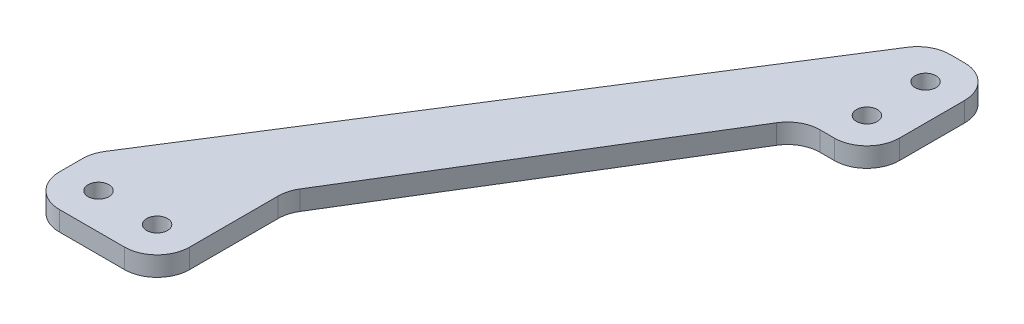
ISO-10303-21;
HEADER;
FILE_DESCRIPTION(('STEP AP214'),'2;1');
FILE_NAME('part.step','',(''),(''),'','','');
FILE_SCHEMA(('AUTOMOTIVE_DESIGN { 1 0 10303 214 1 1 1 1 }'));
ENDSEC;
DATA;
#1=APPLICATION_CONTEXT('core data for automotive mechanical design processes');
#2=APPLICATION_PROTOCOL_DEFINITION('international standard','automotive_design',2000,#1);
#3=PRODUCT_CONTEXT('',#1,'mechanical');
#4=PRODUCT('Part','Part','',(#3));
#5=PRODUCT_RELATED_PRODUCT_CATEGORY('part','',(#4));
#6=PRODUCT_DEFINITION_FORMATION('','',#4);
#7=PRODUCT_DEFINITION_CONTEXT('part definition',#1,'design');
#8=PRODUCT_DEFINITION('design','',#6,#7);
#9=PRODUCT_DEFINITION_SHAPE('','',#8);
#10=(LENGTH_UNIT() NAMED_UNIT(*) SI_UNIT(.MILLI.,.METRE.));
#11=(NAMED_UNIT(*) PLANE_ANGLE_UNIT() SI_UNIT($,.RADIAN.));
#12=(NAMED_UNIT(*) SI_UNIT($,.STERADIAN.) SOLID_ANGLE_UNIT());
#13=UNCERTAINTY_MEASURE_WITH_UNIT(LENGTH_MEASURE(1.E-05),#10,'distance_accuracy_value','');
#14=(GEOMETRIC_REPRESENTATION_CONTEXT(3) GLOBAL_UNCERTAINTY_ASSIGNED_CONTEXT((#13)) GLOBAL_UNIT_ASSIGNED_CONTEXT((#10,
#11,#12)) REPRESENTATION_CONTEXT('',''));
#15=CARTESIAN_POINT('',(0.,0.,0.));
#16=DIRECTION('',(0.,0.,1.));
#17=DIRECTION('',(1.,0.,0.));
#18=AXIS2_PLACEMENT_3D('',#15,#16,#17);
#19=CARTESIAN_POINT('',(0.,3.,0.));
#20=DIRECTION('',(0.,-1.,0.));
#21=DIRECTION('',(0.,0.,-1.));
#22=AXIS2_PLACEMENT_3D('',#19,#20,#21);
#23=PLANE('',#22);
#24=DIRECTION('',(-0.534797593347791,0.,0.84498019748951));
#25=VECTOR('',#24,1.);
#26=CARTESIAN_POINT('',(50.,3.,-89.));
#27=LINE('',#26,#25);
#28=CARTESIAN_POINT('',(48.5278404852778,3.,-86.6739879667389));
#29=VERTEX_POINT('',#28);
#30=CARTESIAN_POINT('',(0.775099012552454,3.,-11.2246564398329));
#31=VERTEX_POINT('',#30);
#32=EDGE_CURVE('E323',#29,#31,#27,.T.);
#33=ORIENTED_EDGE('',*,*,#32,.T.);
#34=CARTESIAN_POINT('',(5.,3.,-8.55066847309392));
#35=DIRECTION('',(0.,-1.,0.));
#36=DIRECTION('',(0.,0.,-1.));
#37=AXIS2_PLACEMENT_3D('',#34,#35,#36);
#38=CIRCLE('',#37,5.);
#39=CARTESIAN_POINT('',(0.,3.,-8.55066847309392));
#40=VERTEX_POINT('',#39);
#41=EDGE_CURVE('E230',#31,#40,#38,.F.);
#42=ORIENTED_EDGE('',*,*,#41,.T.);
#43=DIRECTION('',(0.,0.,1.));
#44=VECTOR('',#43,1.);
#45=CARTESIAN_POINT('',(0.,3.,-10.));
#46=LINE('',#45,#44);
#47=CARTESIAN_POINT('',(0.,3.,-5.));
#48=VERTEX_POINT('',#47);
#49=EDGE_CURVE('E175',#40,#48,#46,.T.);
#50=ORIENTED_EDGE('',*,*,#49,.T.);
#51=CARTESIAN_POINT('',(5.,3.,-5.));
#52=DIRECTION('',(0.,-1.,0.));
#53=DIRECTION('',(0.,0.,-1.));
#54=AXIS2_PLACEMENT_3D('',#51,#52,#53);
#55=CIRCLE('',#54,5.);
#56=CARTESIAN_POINT('',(5.,3.,0.));
#57=VERTEX_POINT('',#56);
#58=EDGE_CURVE('E219',#48,#57,#55,.F.);
#59=ORIENTED_EDGE('',*,*,#58,.T.);
#60=DIRECTION('',(1.,0.,0.));
#61=VECTOR('',#60,1.);
#62=CARTESIAN_POINT('',(0.,3.,0.));
#63=LINE('',#62,#61);
#64=CARTESIAN_POINT('',(15.,3.,0.));
#65=VERTEX_POINT('',#64);
#66=EDGE_CURVE('E185',#57,#65,#63,.T.);
#67=ORIENTED_EDGE('',*,*,#66,.T.);
#68=CARTESIAN_POINT('',(15.,3.,-5.));
#69=DIRECTION('',(0.,-1.,0.));
#70=DIRECTION('',(0.,0.,-1.));
#71=AXIS2_PLACEMENT_3D('',#68,#69,#70);
#72=CIRCLE('',#71,5.);
#73=CARTESIAN_POINT('',(20.,3.,-5.));
#74=VERTEX_POINT('',#73);
#75=EDGE_CURVE('E216',#65,#74,#72,.F.);
#76=ORIENTED_EDGE('',*,*,#75,.T.);
#77=DIRECTION('',(0.,0.,-1.));
#78=VECTOR('',#77,1.);
#79=CARTESIAN_POINT('',(20.,3.,-20.));
#80=LINE('',#79,#78);
#81=CARTESIAN_POINT('',(20.,3.,-18.5909450518512));
#82=VERTEX_POINT('',#81);
#83=EDGE_CURVE('E191',#74,#82,#80,.T.);
#84=ORIENTED_EDGE('',*,*,#83,.T.);
#85=CARTESIAN_POINT('',(25.,3.,-18.5909450518512));
#86=DIRECTION('',(0.,-1.,0.));
#87=DIRECTION('',(0.,0.,-1.));
#88=AXIS2_PLACEMENT_3D('',#85,#86,#87);
#89=CIRCLE('',#88,5.);
#90=CARTESIAN_POINT('',(20.7357434796187,3.,-21.2017143500438));
#91=VERTEX_POINT('',#90);
#92=EDGE_CURVE('E11',#82,#91,#89,.T.);
#93=ORIENTED_EDGE('',*,*,#92,.T.);
#94=DIRECTION('',(0.52215385963853,0.,-0.852851304076266));
#95=VECTOR('',#94,1.);
#96=CARTESIAN_POINT('',(50.,3.,-69.));
#97=LINE('',#96,#95);
#98=CARTESIAN_POINT('',(48.537205692771,3.,-66.6107692981927));
#99=VERTEX_POINT('',#98);
#100=EDGE_CURVE('E303',#91,#99,#97,.T.);
#101=ORIENTED_EDGE('',*,*,#100,.T.);
#102=CARTESIAN_POINT('',(52.8014622131523,3.,-64.));
#103=DIRECTION('',(0.,-1.,0.));
#104=DIRECTION('',(0.,0.,-1.));
#105=AXIS2_PLACEMENT_3D('',#102,#103,#104);
#106=CIRCLE('',#105,5.);
#107=CARTESIAN_POINT('',(52.8014622131523,3.,-69.));
#108=VERTEX_POINT('',#107);
#109=EDGE_CURVE('E277',#99,#108,#106,.T.);
#110=ORIENTED_EDGE('',*,*,#109,.T.);
#111=DIRECTION('',(1.,0.,0.));
#112=VECTOR('',#111,1.);
#113=CARTESIAN_POINT('',(60.,3.,-69.));
#114=LINE('',#113,#112);
#115=CARTESIAN_POINT('',(55.,3.,-69.));
#116=VERTEX_POINT('',#115);
#117=EDGE_CURVE('E309',#108,#116,#114,.T.);
#118=ORIENTED_EDGE('',*,*,#117,.T.);
#119=CARTESIAN_POINT('',(55.,3.,-74.));
#120=DIRECTION('',(0.,-1.,0.));
#121=DIRECTION('',(0.,0.,-1.));
#122=AXIS2_PLACEMENT_3D('',#119,#120,#121);
#123=CIRCLE('',#122,5.);
#124=CARTESIAN_POINT('',(60.,3.,-74.));
#125=VERTEX_POINT('',#124);
#126=EDGE_CURVE('E222',#116,#125,#123,.F.);
#127=ORIENTED_EDGE('',*,*,#126,.T.);
#128=DIRECTION('',(0.,0.,-1.));
#129=VECTOR('',#128,1.);
#130=CARTESIAN_POINT('',(60.,3.,-69.));
#131=LINE('',#130,#129);
#132=CARTESIAN_POINT('',(60.,3.,-84.));
#133=VERTEX_POINT('',#132);
#134=EDGE_CURVE('E314',#125,#133,#131,.T.);
#135=ORIENTED_EDGE('',*,*,#134,.T.);
#136=CARTESIAN_POINT('',(55.,3.,-84.));
#137=DIRECTION('',(0.,-1.,0.));
#138=DIRECTION('',(0.,0.,-1.));
#139=AXIS2_PLACEMENT_3D('',#136,#137,#138);
#140=CIRCLE('',#139,5.);
#141=CARTESIAN_POINT('',(55.,3.,-89.));
#142=VERTEX_POINT('',#141);
#143=EDGE_CURVE('E62',#133,#142,#140,.F.);
#144=ORIENTED_EDGE('',*,*,#143,.T.);
#145=DIRECTION('',(-1.,0.,0.));
#146=VECTOR('',#145,1.);
#147=CARTESIAN_POINT('',(60.,3.,-89.));
#148=LINE('',#147,#146);
#149=CARTESIAN_POINT('',(52.7527414727254,3.,-89.));
#150=VERTEX_POINT('',#149);
#151=EDGE_CURVE('E320',#142,#150,#148,.T.);
#152=ORIENTED_EDGE('',*,*,#151,.T.);
#153=CARTESIAN_POINT('',(52.7527414727254,3.,-84.));
#154=DIRECTION('',(0.,-1.,0.));
#155=DIRECTION('',(0.,0.,-1.));
#156=AXIS2_PLACEMENT_3D('',#153,#154,#155);
#157=CIRCLE('',#156,5.);
#158=EDGE_CURVE('E227',#150,#29,#157,.F.);
#159=ORIENTED_EDGE('',*,*,#158,.T.);
#160=EDGE_LOOP('',(#33,#42,#50,#59,#67,#76,#84,#93,#101,#110,#118,#127,#135,#144,#152,#159));
#161=FACE_BOUND('',#160,.T.);
#162=CARTESIAN_POINT('',(54.5,3.,-83.5));
#163=DIRECTION('',(0.,1.,0.));
#164=DIRECTION('',(0.,0.,1.));
#165=AXIS2_PLACEMENT_3D('',#162,#163,#164);
#166=CIRCLE('',#165,1.6);
#167=CARTESIAN_POINT('',(54.5,3.,-81.9));
#168=VERTEX_POINT('',#167);
#169=EDGE_CURVE('E330',#168,#168,#166,.T.);
#170=ORIENTED_EDGE('',*,*,#169,.F.);
#171=EDGE_LOOP('',(#170));
#172=FACE_BOUND('',#171,.T.);
#173=CARTESIAN_POINT('',(54.5,3.,-74.5));
#174=DIRECTION('',(0.,1.,0.));
#175=DIRECTION('',(0.,0.,-1.));
#176=AXIS2_PLACEMENT_3D('',#173,#174,#175);
#177=CIRCLE('',#176,1.6);
#178=CARTESIAN_POINT('',(54.5,3.,-76.1));
#179=VERTEX_POINT('',#178);
#180=EDGE_CURVE('E411',#179,#179,#177,.T.);
#181=ORIENTED_EDGE('',*,*,#180,.F.);
#182=EDGE_LOOP('',(#181));
#183=FACE_BOUND('',#182,.T.);
#184=CARTESIAN_POINT('',(5.5,3.,-5.5));
#185=DIRECTION('',(0.,1.,0.));
#186=DIRECTION('',(0.,0.,1.));
#187=AXIS2_PLACEMENT_3D('',#184,#185,#186);
#188=CIRCLE('',#187,1.6);
#189=CARTESIAN_POINT('',(5.5,3.,-3.9));
#190=VERTEX_POINT('',#189);
#191=EDGE_CURVE('E403',#190,#190,#188,.T.);
#192=ORIENTED_EDGE('',*,*,#191,.F.);
#193=EDGE_LOOP('',(#192));
#194=FACE_BOUND('',#193,.T.);
#195=CARTESIAN_POINT('',(14.5,3.,-5.5));
#196=DIRECTION('',(0.,1.,0.));
#197=DIRECTION('',(0.,0.,1.));
#198=AXIS2_PLACEMENT_3D('',#195,#196,#197);
#199=CIRCLE('',#198,1.6);
#200=CARTESIAN_POINT('',(14.5,3.,-3.9));
#201=VERTEX_POINT('',#200);
#202=EDGE_CURVE('E392',#201,#201,#199,.T.);
#203=ORIENTED_EDGE('',*,*,#202,.F.);
#204=EDGE_LOOP('',(#203));
#205=FACE_BOUND('',#204,.T.);
#206=ADVANCED_FACE('F39',(#161,#172,#183,#194,#205),#23,.F.);
#207=CARTESIAN_POINT('',(0.,0.,0.));
#208=DIRECTION('',(0.,-1.,0.));
#209=DIRECTION('',(0.,0.,-1.));
#210=AXIS2_PLACEMENT_3D('',#207,#208,#209);
#211=PLANE('',#210);
#212=CARTESIAN_POINT('',(5.5,0.,-5.5));
#213=DIRECTION('',(0.,1.,0.));
#214=DIRECTION('',(0.,0.,1.));
#215=AXIS2_PLACEMENT_3D('',#212,#213,#214);
#216=CIRCLE('',#215,1.6);
#217=CARTESIAN_POINT('',(5.5,0.,-3.9));
#218=VERTEX_POINT('',#217);
#219=EDGE_CURVE('E400',#218,#218,#216,.T.);
#220=ORIENTED_EDGE('',*,*,#219,.T.);
#221=EDGE_LOOP('',(#220));
#222=FACE_BOUND('',#221,.T.);
#223=CARTESIAN_POINT('',(54.5,0.,-83.5));
#224=DIRECTION('',(0.,1.,0.));
#225=DIRECTION('',(0.,0.,1.));
#226=AXIS2_PLACEMENT_3D('',#223,#224,#225);
#227=CIRCLE('',#226,1.6);
#228=CARTESIAN_POINT('',(54.5,0.,-81.9));
#229=VERTEX_POINT('',#228);
#230=EDGE_CURVE('E415',#229,#229,#227,.T.);
#231=ORIENTED_EDGE('',*,*,#230,.T.);
#232=EDGE_LOOP('',(#231));
#233=FACE_BOUND('',#232,.T.);
#234=DIRECTION('',(0.,0.,1.));
#235=VECTOR('',#234,1.);
#236=CARTESIAN_POINT('',(0.,0.,-10.));
#237=LINE('',#236,#235);
#238=CARTESIAN_POINT('',(0.,0.,-8.55066847309392));
#239=VERTEX_POINT('',#238);
#240=CARTESIAN_POINT('',(0.,0.,-5.));
#241=VERTEX_POINT('',#240);
#242=EDGE_CURVE('E172',#239,#241,#237,.T.);
#243=ORIENTED_EDGE('',*,*,#242,.F.);
#244=CARTESIAN_POINT('',(5.,0.,-8.55066847309392));
#245=DIRECTION('',(0.,-1.,0.));
#246=DIRECTION('',(0.,0.,-1.));
#247=AXIS2_PLACEMENT_3D('',#244,#245,#246);
#248=CIRCLE('',#247,5.);
#249=CARTESIAN_POINT('',(0.775099012552454,0.,-11.2246564398329));
#250=VERTEX_POINT('',#249);
#251=EDGE_CURVE('E154',#239,#250,#248,.T.);
#252=ORIENTED_EDGE('',*,*,#251,.T.);
#253=DIRECTION('',(-0.534797593347791,0.,0.84498019748951));
#254=VECTOR('',#253,1.);
#255=CARTESIAN_POINT('',(50.,0.,-89.));
#256=LINE('',#255,#254);
#257=CARTESIAN_POINT('',(48.5278404852778,0.,-86.6739879667389));
#258=VERTEX_POINT('',#257);
#259=EDGE_CURVE('E186',#258,#250,#256,.T.);
#260=ORIENTED_EDGE('',*,*,#259,.F.);
#261=CARTESIAN_POINT('',(52.7527414727254,0.,-84.));
#262=DIRECTION('',(0.,-1.,0.));
#263=DIRECTION('',(0.,0.,-1.));
#264=AXIS2_PLACEMENT_3D('',#261,#262,#263);
#265=CIRCLE('',#264,5.);
#266=CARTESIAN_POINT('',(52.7527414727254,0.,-89.));
#267=VERTEX_POINT('',#266);
#268=EDGE_CURVE('E166',#258,#267,#265,.T.);
#269=ORIENTED_EDGE('',*,*,#268,.T.);
#270=DIRECTION('',(-1.,0.,0.));
#271=VECTOR('',#270,1.);
#272=CARTESIAN_POINT('',(60.,0.,-89.));
#273=LINE('',#272,#271);
#274=CARTESIAN_POINT('',(55.,0.,-89.));
#275=VERTEX_POINT('',#274);
#276=EDGE_CURVE('E193',#275,#267,#273,.T.);
#277=ORIENTED_EDGE('',*,*,#276,.F.);
#278=CARTESIAN_POINT('',(55.,0.,-84.));
#279=DIRECTION('',(0.,-1.,0.));
#280=DIRECTION('',(0.,0.,-1.));
#281=AXIS2_PLACEMENT_3D('',#278,#279,#280);
#282=CIRCLE('',#281,5.);
#283=CARTESIAN_POINT('',(60.,0.,-84.));
#284=VERTEX_POINT('',#283);
#285=EDGE_CURVE('E206',#275,#284,#282,.T.);
#286=ORIENTED_EDGE('',*,*,#285,.T.);
#287=DIRECTION('',(0.,0.,-1.));
#288=VECTOR('',#287,1.);
#289=CARTESIAN_POINT('',(60.,0.,-69.));
#290=LINE('',#289,#288);
#291=CARTESIAN_POINT('',(60.,0.,-74.));
#292=VERTEX_POINT('',#291);
#293=EDGE_CURVE('E338',#292,#284,#290,.T.);
#294=ORIENTED_EDGE('',*,*,#293,.F.);
#295=CARTESIAN_POINT('',(55.,0.,-74.));
#296=DIRECTION('',(0.,-1.,0.));
#297=DIRECTION('',(0.,0.,-1.));
#298=AXIS2_PLACEMENT_3D('',#295,#296,#297);
#299=CIRCLE('',#298,5.);
#300=CARTESIAN_POINT('',(55.,0.,-69.));
#301=VERTEX_POINT('',#300);
#302=EDGE_CURVE('E203',#292,#301,#299,.T.);
#303=ORIENTED_EDGE('',*,*,#302,.T.);
#304=DIRECTION('',(1.,0.,0.));
#305=VECTOR('',#304,1.);
#306=CARTESIAN_POINT('',(60.,0.,-69.));
#307=LINE('',#306,#305);
#308=CARTESIAN_POINT('',(52.8014622131523,0.,-69.));
#309=VERTEX_POINT('',#308);
#310=EDGE_CURVE('E334',#309,#301,#307,.T.);
#311=ORIENTED_EDGE('',*,*,#310,.F.);
#312=CARTESIAN_POINT('',(52.8014622131523,0.,-64.));
#313=DIRECTION('',(0.,-1.,0.));
#314=DIRECTION('',(0.,0.,-1.));
#315=AXIS2_PLACEMENT_3D('',#312,#313,#314);
#316=CIRCLE('',#315,5.);
#317=CARTESIAN_POINT('',(48.537205692771,0.,-66.6107692981927));
#318=VERTEX_POINT('',#317);
#319=EDGE_CURVE('E274',#309,#318,#316,.F.);
#320=ORIENTED_EDGE('',*,*,#319,.T.);
#321=DIRECTION('',(0.52215385963853,0.,-0.852851304076266));
#322=VECTOR('',#321,1.);
#323=CARTESIAN_POINT('',(50.,0.,-69.));
#324=LINE('',#323,#322);
#325=CARTESIAN_POINT('',(20.7357434796187,0.,-21.2017143500438));
#326=VERTEX_POINT('',#325);
#327=EDGE_CURVE('E285',#326,#318,#324,.T.);
#328=ORIENTED_EDGE('',*,*,#327,.F.);
#329=CARTESIAN_POINT('',(25.,0.,-18.5909450518512));
#330=DIRECTION('',(0.,-1.,0.));
#331=DIRECTION('',(0.,0.,-1.));
#332=AXIS2_PLACEMENT_3D('',#329,#330,#331);
#333=CIRCLE('',#332,5.);
#334=CARTESIAN_POINT('',(20.,0.,-18.5909450518512));
#335=VERTEX_POINT('',#334);
#336=EDGE_CURVE('E48',#326,#335,#333,.F.);
#337=ORIENTED_EDGE('',*,*,#336,.T.);
#338=DIRECTION('',(0.,0.,-1.));
#339=VECTOR('',#338,1.);
#340=CARTESIAN_POINT('',(20.,0.,-20.));
#341=LINE('',#340,#339);
#342=CARTESIAN_POINT('',(20.,0.,-5.));
#343=VERTEX_POINT('',#342);
#344=EDGE_CURVE('E283',#343,#335,#341,.T.);
#345=ORIENTED_EDGE('',*,*,#344,.F.);
#346=CARTESIAN_POINT('',(15.,0.,-5.));
#347=DIRECTION('',(0.,-1.,0.));
#348=DIRECTION('',(0.,0.,-1.));
#349=AXIS2_PLACEMENT_3D('',#346,#347,#348);
#350=CIRCLE('',#349,5.);
#351=CARTESIAN_POINT('',(15.,0.,0.));
#352=VERTEX_POINT('',#351);
#353=EDGE_CURVE('E177',#343,#352,#350,.T.);
#354=ORIENTED_EDGE('',*,*,#353,.T.);
#355=DIRECTION('',(1.,0.,0.));
#356=VECTOR('',#355,1.);
#357=CARTESIAN_POINT('',(0.,0.,0.));
#358=LINE('',#357,#356);
#359=CARTESIAN_POINT('',(5.,0.,0.));
#360=VERTEX_POINT('',#359);
#361=EDGE_CURVE('E295',#360,#352,#358,.T.);
#362=ORIENTED_EDGE('',*,*,#361,.F.);
#363=CARTESIAN_POINT('',(5.,0.,-5.));
#364=DIRECTION('',(0.,-1.,0.));
#365=DIRECTION('',(0.,0.,-1.));
#366=AXIS2_PLACEMENT_3D('',#363,#364,#365);
#367=CIRCLE('',#366,5.);
#368=EDGE_CURVE('E183',#360,#241,#367,.T.);
#369=ORIENTED_EDGE('',*,*,#368,.T.);
#370=EDGE_LOOP('',(#243,#252,#260,#269,#277,#286,#294,#303,#311,#320,#328,#337,#345,#354,#362,#369));
#371=FACE_BOUND('',#370,.T.);
#372=CARTESIAN_POINT('',(54.5,0.,-74.5));
#373=DIRECTION('',(0.,1.,0.));
#374=DIRECTION('',(0.,0.,-1.));
#375=AXIS2_PLACEMENT_3D('',#372,#373,#374);
#376=CIRCLE('',#375,1.6);
#377=CARTESIAN_POINT('',(54.5,0.,-76.1));
#378=VERTEX_POINT('',#377);
#379=EDGE_CURVE('E407',#378,#378,#376,.T.);
#380=ORIENTED_EDGE('',*,*,#379,.T.);
#381=EDGE_LOOP('',(#380));
#382=FACE_BOUND('',#381,.T.);
#383=CARTESIAN_POINT('',(14.5,0.,-5.5));
#384=DIRECTION('',(0.,1.,0.));
#385=DIRECTION('',(0.,0.,1.));
#386=AXIS2_PLACEMENT_3D('',#383,#384,#385);
#387=CIRCLE('',#386,1.6);
#388=CARTESIAN_POINT('',(14.5,0.,-3.9));
#389=VERTEX_POINT('',#388);
#390=EDGE_CURVE('E395',#389,#389,#387,.T.);
#391=ORIENTED_EDGE('',*,*,#390,.T.);
#392=EDGE_LOOP('',(#391));
#393=FACE_BOUND('',#392,.T.);
#394=ADVANCED_FACE('F180',(#222,#233,#371,#382,#393),#211,.T.);
#395=CARTESIAN_POINT('',(0.,3.,0.));
#396=DIRECTION('',(0.,0.,-1.));
#397=DIRECTION('',(-1.,0.,0.));
#398=AXIS2_PLACEMENT_3D('',#395,#396,#397);
#399=PLANE('',#398);
#400=ORIENTED_EDGE('',*,*,#66,.F.);
#401=DIRECTION('',(0.,-1.,0.));
#402=VECTOR('',#401,1.);
#403=CARTESIAN_POINT('',(5.,3.,0.));
#404=LINE('',#403,#402);
#405=EDGE_CURVE('E263',#57,#360,#404,.T.);
#406=ORIENTED_EDGE('',*,*,#405,.T.);
#407=ORIENTED_EDGE('',*,*,#361,.T.);
#408=DIRECTION('',(0.,-1.,0.));
#409=VECTOR('',#408,1.);
#410=CARTESIAN_POINT('',(15.,3.,0.));
#411=LINE('',#410,#409);
#412=EDGE_CURVE('E260',#352,#65,#411,.F.);
#413=ORIENTED_EDGE('',*,*,#412,.T.);
#414=EDGE_LOOP('',(#400,#406,#407,#413));
#415=FACE_BOUND('',#414,.T.);
#416=ADVANCED_FACE('F367',(#415),#399,.F.);
#417=CARTESIAN_POINT('',(20.,3.,-20.));
#418=DIRECTION('',(-1.,0.,0.));
#419=DIRECTION('',(0.,0.,1.));
#420=AXIS2_PLACEMENT_3D('',#417,#418,#419);
#421=PLANE('',#420);
#422=ORIENTED_EDGE('',*,*,#344,.T.);
#423=DIRECTION('',(0.,-1.,0.));
#424=VECTOR('',#423,1.);
#425=CARTESIAN_POINT('',(20.,3.,-18.5909450518512));
#426=LINE('',#425,#424);
#427=EDGE_CURVE('E271',#335,#82,#426,.F.);
#428=ORIENTED_EDGE('',*,*,#427,.T.);
#429=ORIENTED_EDGE('',*,*,#83,.F.);
#430=DIRECTION('',(0.,-1.,0.));
#431=VECTOR('',#430,1.);
#432=CARTESIAN_POINT('',(20.,3.,-5.));
#433=LINE('',#432,#431);
#434=EDGE_CURVE('E267',#74,#343,#433,.T.);
#435=ORIENTED_EDGE('',*,*,#434,.T.);
#436=EDGE_LOOP('',(#422,#428,#429,#435));
#437=FACE_BOUND('',#436,.T.);
#438=ADVANCED_FACE('F290',(#437),#421,.F.);
#439=CARTESIAN_POINT('',(50.,3.,-69.));
#440=DIRECTION('',(-0.852851304076266,0.,-0.52215385963853));
#441=DIRECTION('',(-0.52215385963853,0.,0.852851304076266));
#442=AXIS2_PLACEMENT_3D('',#439,#440,#441);
#443=PLANE('',#442);
#444=ORIENTED_EDGE('',*,*,#327,.T.);
#445=DIRECTION('',(0.,-1.,0.));
#446=VECTOR('',#445,1.);
#447=CARTESIAN_POINT('',(48.537205692771,3.,-66.6107692981927));
#448=LINE('',#447,#446);
#449=EDGE_CURVE('E257',#318,#99,#448,.F.);
#450=ORIENTED_EDGE('',*,*,#449,.T.);
#451=ORIENTED_EDGE('',*,*,#100,.F.);
#452=DIRECTION('',(0.,-1.,0.));
#453=VECTOR('',#452,1.);
#454=CARTESIAN_POINT('',(20.7357434796187,0.,-21.2017143500438));
#455=LINE('',#454,#453);
#456=EDGE_CURVE('E253',#91,#326,#455,.T.);
#457=ORIENTED_EDGE('',*,*,#456,.T.);
#458=EDGE_LOOP('',(#444,#450,#451,#457));
#459=FACE_BOUND('',#458,.T.);
#460=ADVANCED_FACE('F306',(#459),#443,.F.);
#461=CARTESIAN_POINT('',(60.,3.,-69.));
#462=DIRECTION('',(0.,0.,-1.));
#463=DIRECTION('',(-1.,0.,0.));
#464=AXIS2_PLACEMENT_3D('',#461,#462,#463);
#465=PLANE('',#464);
#466=ORIENTED_EDGE('',*,*,#310,.T.);
#467=DIRECTION('',(0.,-1.,0.));
#468=VECTOR('',#467,1.);
#469=CARTESIAN_POINT('',(55.,3.,-69.));
#470=LINE('',#469,#468);
#471=EDGE_CURVE('E250',#301,#116,#470,.F.);
#472=ORIENTED_EDGE('',*,*,#471,.T.);
#473=ORIENTED_EDGE('',*,*,#117,.F.);
#474=DIRECTION('',(0.,-1.,0.));
#475=VECTOR('',#474,1.);
#476=CARTESIAN_POINT('',(52.8014622131523,0.,-69.));
#477=LINE('',#476,#475);
#478=EDGE_CURVE('E246',#108,#309,#477,.T.);
#479=ORIENTED_EDGE('',*,*,#478,.T.);
#480=EDGE_LOOP('',(#466,#472,#473,#479));
#481=FACE_BOUND('',#480,.T.);
#482=ADVANCED_FACE('F479',(#481),#465,.F.);
#483=CARTESIAN_POINT('',(60.,3.,-69.));
#484=DIRECTION('',(-1.,0.,0.));
#485=DIRECTION('',(0.,0.,1.));
#486=AXIS2_PLACEMENT_3D('',#483,#484,#485);
#487=PLANE('',#486);
#488=ORIENTED_EDGE('',*,*,#293,.T.);
#489=DIRECTION('',(0.,-1.,0.));
#490=VECTOR('',#489,1.);
#491=CARTESIAN_POINT('',(60.,3.,-84.));
#492=LINE('',#491,#490);
#493=EDGE_CURVE('E243',#284,#133,#492,.F.);
#494=ORIENTED_EDGE('',*,*,#493,.T.);
#495=ORIENTED_EDGE('',*,*,#134,.F.);
#496=DIRECTION('',(0.,-1.,0.));
#497=VECTOR('',#496,1.);
#498=CARTESIAN_POINT('',(60.,3.,-74.));
#499=LINE('',#498,#497);
#500=EDGE_CURVE('E239',#125,#292,#499,.T.);
#501=ORIENTED_EDGE('',*,*,#500,.T.);
#502=EDGE_LOOP('',(#488,#494,#495,#501));
#503=FACE_BOUND('',#502,.T.);
#504=ADVANCED_FACE('F360',(#503),#487,.F.);
#505=CARTESIAN_POINT('',(60.,3.,-89.));
#506=DIRECTION('',(0.,0.,1.));
#507=DIRECTION('',(1.,0.,0.));
#508=AXIS2_PLACEMENT_3D('',#505,#506,#507);
#509=PLANE('',#508);
#510=ORIENTED_EDGE('',*,*,#276,.T.);
#511=DIRECTION('',(0.,-1.,0.));
#512=VECTOR('',#511,1.);
#513=CARTESIAN_POINT('',(52.7527414727254,3.,-89.));
#514=LINE('',#513,#512);
#515=EDGE_CURVE('E55',#267,#150,#514,.F.);
#516=ORIENTED_EDGE('',*,*,#515,.T.);
#517=ORIENTED_EDGE('',*,*,#151,.F.);
#518=DIRECTION('',(0.,-1.,0.));
#519=VECTOR('',#518,1.);
#520=CARTESIAN_POINT('',(55.,3.,-89.));
#521=LINE('',#520,#519);
#522=EDGE_CURVE('E233',#142,#275,#521,.T.);
#523=ORIENTED_EDGE('',*,*,#522,.T.);
#524=EDGE_LOOP('',(#510,#516,#517,#523));
#525=FACE_BOUND('',#524,.T.);
#526=ADVANCED_FACE('F343',(#525),#509,.F.);
#527=CARTESIAN_POINT('',(50.,3.,-89.));
#528=DIRECTION('',(0.84498019748951,0.,0.534797593347791));
#529=DIRECTION('',(0.534797593347791,0.,-0.84498019748951));
#530=AXIS2_PLACEMENT_3D('',#527,#528,#529);
#531=PLANE('',#530);
#532=ORIENTED_EDGE('',*,*,#259,.T.);
#533=DIRECTION('',(0.,-1.,0.));
#534=VECTOR('',#533,1.);
#535=CARTESIAN_POINT('',(0.775099012552433,3.,-11.2246564398329));
#536=LINE('',#535,#534);
#537=EDGE_CURVE('E159',#250,#31,#536,.F.);
#538=ORIENTED_EDGE('',*,*,#537,.T.);
#539=ORIENTED_EDGE('',*,*,#32,.F.);
#540=DIRECTION('',(0.,-1.,0.));
#541=VECTOR('',#540,1.);
#542=CARTESIAN_POINT('',(48.5278404852778,3.,-86.6739879667389));
#543=LINE('',#542,#541);
#544=EDGE_CURVE('E165',#29,#258,#543,.T.);
#545=ORIENTED_EDGE('',*,*,#544,.T.);
#546=EDGE_LOOP('',(#532,#538,#539,#545));
#547=FACE_BOUND('',#546,.T.);
#548=ADVANCED_FACE('F351',(#547),#531,.F.);
#549=CARTESIAN_POINT('',(0.,3.,-10.));
#550=DIRECTION('',(1.,0.,0.));
#551=DIRECTION('',(0.,0.,-1.));
#552=AXIS2_PLACEMENT_3D('',#549,#550,#551);
#553=PLANE('',#552);
#554=ORIENTED_EDGE('',*,*,#49,.F.);
#555=DIRECTION('',(0.,-1.,0.));
#556=VECTOR('',#555,1.);
#557=CARTESIAN_POINT('',(0.,3.,-8.55066847309392));
#558=LINE('',#557,#556);
#559=EDGE_CURVE('E158',#40,#239,#558,.T.);
#560=ORIENTED_EDGE('',*,*,#559,.T.);
#561=ORIENTED_EDGE('',*,*,#242,.T.);
#562=DIRECTION('',(0.,-1.,0.));
#563=VECTOR('',#562,1.);
#564=CARTESIAN_POINT('',(0.,3.,-5.));
#565=LINE('',#564,#563);
#566=EDGE_CURVE('E178',#241,#48,#565,.F.);
#567=ORIENTED_EDGE('',*,*,#566,.T.);
#568=EDGE_LOOP('',(#554,#560,#561,#567));
#569=FACE_BOUND('',#568,.T.);
#570=ADVANCED_FACE('F171',(#569),#553,.F.);
#571=CARTESIAN_POINT('',(54.5,3.,-83.5));
#572=DIRECTION('',(0.,-1.,0.));
#573=DIRECTION('',(0.,0.,-1.));
#574=AXIS2_PLACEMENT_3D('',#571,#572,#573);
#575=CYLINDRICAL_SURFACE('',#574,1.6);
#576=ORIENTED_EDGE('',*,*,#169,.T.);
#577=EDGE_LOOP('',(#576));
#578=FACE_BOUND('',#577,.T.);
#579=ORIENTED_EDGE('',*,*,#230,.F.);
#580=EDGE_LOOP('',(#579));
#581=FACE_BOUND('',#580,.T.);
#582=ADVANCED_FACE('F358',(#578,#581),#575,.F.);
#583=CARTESIAN_POINT('',(54.5,3.,-74.5));
#584=DIRECTION('',(0.,-1.,0.));
#585=DIRECTION('',(0.,0.,-1.));
#586=AXIS2_PLACEMENT_3D('',#583,#584,#585);
#587=CYLINDRICAL_SURFACE('',#586,1.6);
#588=ORIENTED_EDGE('',*,*,#180,.T.);
#589=EDGE_LOOP('',(#588));
#590=FACE_BOUND('',#589,.T.);
#591=ORIENTED_EDGE('',*,*,#379,.F.);
#592=EDGE_LOOP('',(#591));
#593=FACE_BOUND('',#592,.T.);
#594=ADVANCED_FACE('F373',(#590,#593),#587,.F.);
#595=CARTESIAN_POINT('',(5.5,3.,-5.5));
#596=DIRECTION('',(0.,-1.,0.));
#597=DIRECTION('',(0.,0.,-1.));
#598=AXIS2_PLACEMENT_3D('',#595,#596,#597);
#599=CYLINDRICAL_SURFACE('',#598,1.6);
#600=ORIENTED_EDGE('',*,*,#191,.T.);
#601=EDGE_LOOP('',(#600));
#602=FACE_BOUND('',#601,.T.);
#603=ORIENTED_EDGE('',*,*,#219,.F.);
#604=EDGE_LOOP('',(#603));
#605=FACE_BOUND('',#604,.T.);
#606=ADVANCED_FACE('F377',(#602,#605),#599,.F.);
#607=CARTESIAN_POINT('',(14.5,3.,-5.5));
#608=DIRECTION('',(0.,-1.,0.));
#609=DIRECTION('',(0.,0.,-1.));
#610=AXIS2_PLACEMENT_3D('',#607,#608,#609);
#611=CYLINDRICAL_SURFACE('',#610,1.6);
#612=ORIENTED_EDGE('',*,*,#202,.T.);
#613=EDGE_LOOP('',(#612));
#614=FACE_BOUND('',#613,.T.);
#615=ORIENTED_EDGE('',*,*,#390,.F.);
#616=EDGE_LOOP('',(#615));
#617=FACE_BOUND('',#616,.T.);
#618=ADVANCED_FACE('F381',(#614,#617),#611,.F.);
#619=CARTESIAN_POINT('',(5.,3.,-8.55066847309392));
#620=DIRECTION('',(0.,-1.,0.));
#621=DIRECTION('',(0.,0.,-1.));
#622=AXIS2_PLACEMENT_3D('',#619,#620,#621);
#623=CYLINDRICAL_SURFACE('',#622,5.);
#624=ORIENTED_EDGE('',*,*,#41,.F.);
#625=ORIENTED_EDGE('',*,*,#537,.F.);
#626=ORIENTED_EDGE('',*,*,#251,.F.);
#627=ORIENTED_EDGE('',*,*,#559,.F.);
#628=EDGE_LOOP('',(#624,#625,#626,#627));
#629=FACE_BOUND('',#628,.T.);
#630=ADVANCED_FACE('F157',(#629),#623,.T.);
#631=CARTESIAN_POINT('',(52.7527414727254,3.,-84.));
#632=DIRECTION('',(0.,-1.,0.));
#633=DIRECTION('',(0.,0.,-1.));
#634=AXIS2_PLACEMENT_3D('',#631,#632,#633);
#635=CYLINDRICAL_SURFACE('',#634,5.);
#636=ORIENTED_EDGE('',*,*,#158,.F.);
#637=ORIENTED_EDGE('',*,*,#515,.F.);
#638=ORIENTED_EDGE('',*,*,#268,.F.);
#639=ORIENTED_EDGE('',*,*,#544,.F.);
#640=EDGE_LOOP('',(#636,#637,#638,#639));
#641=FACE_BOUND('',#640,.T.);
#642=ADVANCED_FACE('F347',(#641),#635,.T.);
#643=CARTESIAN_POINT('',(55.,3.,-84.));
#644=DIRECTION('',(0.,-1.,0.));
#645=DIRECTION('',(0.,0.,-1.));
#646=AXIS2_PLACEMENT_3D('',#643,#644,#645);
#647=CYLINDRICAL_SURFACE('',#646,5.);
#648=ORIENTED_EDGE('',*,*,#143,.F.);
#649=ORIENTED_EDGE('',*,*,#493,.F.);
#650=ORIENTED_EDGE('',*,*,#285,.F.);
#651=ORIENTED_EDGE('',*,*,#522,.F.);
#652=EDGE_LOOP('',(#648,#649,#650,#651));
#653=FACE_BOUND('',#652,.T.);
#654=ADVANCED_FACE('F440',(#653),#647,.T.);
#655=CARTESIAN_POINT('',(55.,3.,-74.));
#656=DIRECTION('',(0.,-1.,0.));
#657=DIRECTION('',(0.,0.,-1.));
#658=AXIS2_PLACEMENT_3D('',#655,#656,#657);
#659=CYLINDRICAL_SURFACE('',#658,5.);
#660=ORIENTED_EDGE('',*,*,#126,.F.);
#661=ORIENTED_EDGE('',*,*,#471,.F.);
#662=ORIENTED_EDGE('',*,*,#302,.F.);
#663=ORIENTED_EDGE('',*,*,#500,.F.);
#664=EDGE_LOOP('',(#660,#661,#662,#663));
#665=FACE_BOUND('',#664,.T.);
#666=ADVANCED_FACE('F447',(#665),#659,.T.);
#667=CARTESIAN_POINT('',(52.8014622131523,3.,-64.));
#668=DIRECTION('',(0.,1.,0.));
#669=DIRECTION('',(0.,0.,1.));
#670=AXIS2_PLACEMENT_3D('',#667,#668,#669);
#671=CYLINDRICAL_SURFACE('',#670,5.);
#672=ORIENTED_EDGE('',*,*,#109,.F.);
#673=ORIENTED_EDGE('',*,*,#449,.F.);
#674=ORIENTED_EDGE('',*,*,#319,.F.);
#675=ORIENTED_EDGE('',*,*,#478,.F.);
#676=EDGE_LOOP('',(#672,#673,#674,#675));
#677=FACE_BOUND('',#676,.T.);
#678=ADVANCED_FACE('F451',(#677),#671,.F.);
#679=CARTESIAN_POINT('',(5.,3.,-5.));
#680=DIRECTION('',(0.,-1.,0.));
#681=DIRECTION('',(0.,0.,-1.));
#682=AXIS2_PLACEMENT_3D('',#679,#680,#681);
#683=CYLINDRICAL_SURFACE('',#682,5.);
#684=ORIENTED_EDGE('',*,*,#58,.F.);
#685=ORIENTED_EDGE('',*,*,#566,.F.);
#686=ORIENTED_EDGE('',*,*,#368,.F.);
#687=ORIENTED_EDGE('',*,*,#405,.F.);
#688=EDGE_LOOP('',(#684,#685,#686,#687));
#689=FACE_BOUND('',#688,.T.);
#690=ADVANCED_FACE('F455',(#689),#683,.T.);
#691=CARTESIAN_POINT('',(25.,3.,-18.5909450518512));
#692=DIRECTION('',(0.,1.,0.));
#693=DIRECTION('',(0.,0.,1.));
#694=AXIS2_PLACEMENT_3D('',#691,#692,#693);
#695=CYLINDRICAL_SURFACE('',#694,5.);
#696=ORIENTED_EDGE('',*,*,#92,.F.);
#697=ORIENTED_EDGE('',*,*,#427,.F.);
#698=ORIENTED_EDGE('',*,*,#336,.F.);
#699=ORIENTED_EDGE('',*,*,#456,.F.);
#700=EDGE_LOOP('',(#696,#697,#698,#699));
#701=FACE_BOUND('',#700,.T.);
#702=ADVANCED_FACE('F298',(#701),#695,.F.);
#703=CARTESIAN_POINT('',(15.,3.,-5.));
#704=DIRECTION('',(0.,-1.,0.));
#705=DIRECTION('',(0.,0.,-1.));
#706=AXIS2_PLACEMENT_3D('',#703,#704,#705);
#707=CYLINDRICAL_SURFACE('',#706,5.);
#708=ORIENTED_EDGE('',*,*,#75,.F.);
#709=ORIENTED_EDGE('',*,*,#412,.F.);
#710=ORIENTED_EDGE('',*,*,#353,.F.);
#711=ORIENTED_EDGE('',*,*,#434,.F.);
#712=EDGE_LOOP('',(#708,#709,#710,#711));
#713=FACE_BOUND('',#712,.T.);
#714=ADVANCED_FACE('F41',(#713),#707,.T.);
#715=CLOSED_SHELL('',(#206,#394,#416,#438,#460,#482,#504,#526,#548,#570,#582,#594,#606,#618,
#630,#642,#654,#666,#678,#690,#702,#714));
#716=MANIFOLD_SOLID_BREP('B2',#715);
#717=ADVANCED_BREP_SHAPE_REPRESENTATION('',(#18,#716),#14);
#718=SHAPE_DEFINITION_REPRESENTATION(#9,#717);
ENDSEC;
END-ISO-10303-21;
